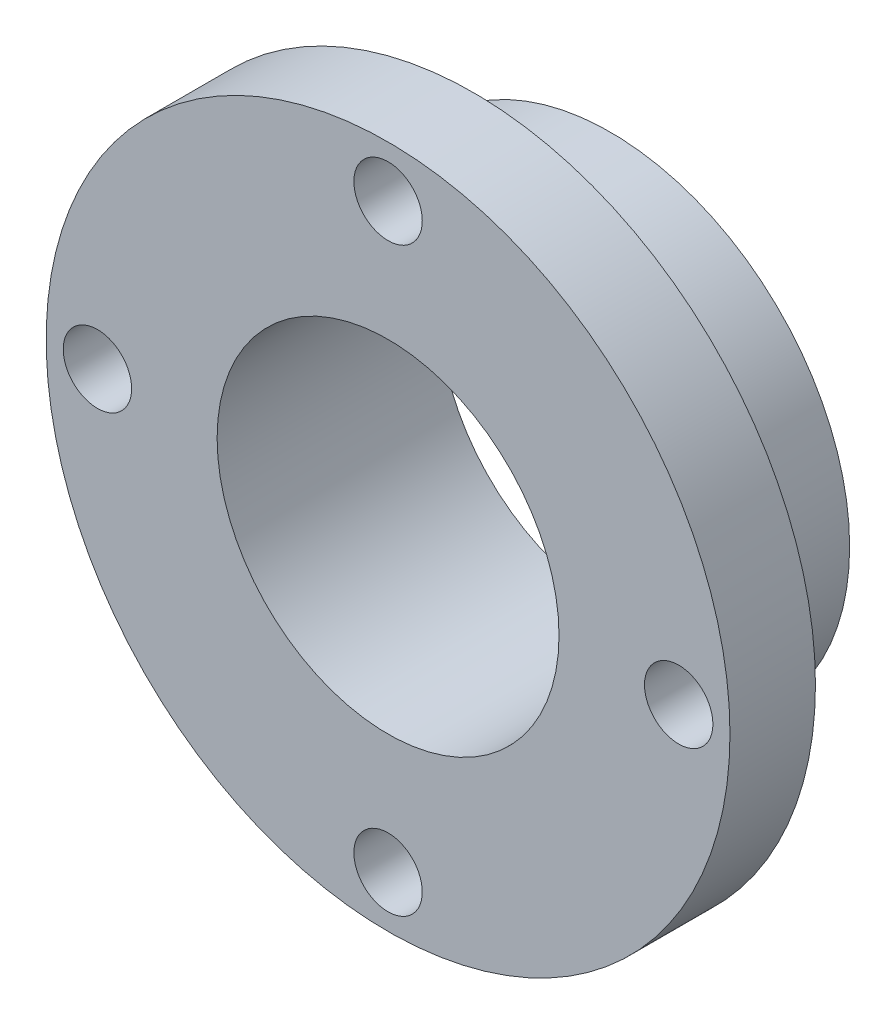
ISO-10303-21;
HEADER;
FILE_DESCRIPTION(('STEP AP214'),'2;1');
FILE_NAME('part.step','',(''),(''),'','','');
FILE_SCHEMA(('AUTOMOTIVE_DESIGN { 1 0 10303 214 1 1 1 1 }'));
ENDSEC;
DATA;
#1=APPLICATION_CONTEXT('core data for automotive mechanical design processes');
#2=APPLICATION_PROTOCOL_DEFINITION('international standard','automotive_design',2000,#1);
#3=PRODUCT_CONTEXT('',#1,'mechanical');
#4=PRODUCT('Part','Part','',(#3));
#5=PRODUCT_RELATED_PRODUCT_CATEGORY('part','',(#4));
#6=PRODUCT_DEFINITION_FORMATION('','',#4);
#7=PRODUCT_DEFINITION_CONTEXT('part definition',#1,'design');
#8=PRODUCT_DEFINITION('design','',#6,#7);
#9=PRODUCT_DEFINITION_SHAPE('','',#8);
#10=(LENGTH_UNIT() NAMED_UNIT(*) SI_UNIT(.MILLI.,.METRE.));
#11=(NAMED_UNIT(*) PLANE_ANGLE_UNIT() SI_UNIT($,.RADIAN.));
#12=(NAMED_UNIT(*) SI_UNIT($,.STERADIAN.) SOLID_ANGLE_UNIT());
#13=UNCERTAINTY_MEASURE_WITH_UNIT(LENGTH_MEASURE(1.E-05),#10,'distance_accuracy_value','');
#14=(GEOMETRIC_REPRESENTATION_CONTEXT(3) GLOBAL_UNCERTAINTY_ASSIGNED_CONTEXT((#13)) GLOBAL_UNIT_ASSIGNED_CONTEXT((#10,
#11,#12)) REPRESENTATION_CONTEXT('',''));
#15=CARTESIAN_POINT('',(0.,0.,0.));
#16=DIRECTION('',(0.,0.,1.));
#17=DIRECTION('',(1.,0.,0.));
#18=AXIS2_PLACEMENT_3D('',#15,#16,#17);
#19=CARTESIAN_POINT('',(0.,0.,0.));
#20=DIRECTION('',(0.,0.,1.));
#21=DIRECTION('',(1.,0.,0.));
#22=AXIS2_PLACEMENT_3D('',#19,#20,#21);
#23=PLANE('',#22);
#24=CARTESIAN_POINT('',(0.,0.,0.));
#25=DIRECTION('',(0.,0.,1.));
#26=DIRECTION('',(1.,0.,0.));
#27=AXIS2_PLACEMENT_3D('',#24,#25,#26);
#28=CIRCLE('',#27,15.);
#29=CARTESIAN_POINT('',(0.,-15.,0.));
#30=VERTEX_POINT('',#29);
#31=CARTESIAN_POINT('',(15.,0.,0.));
#32=VERTEX_POINT('',#31);
#33=EDGE_CURVE('E70',#30,#32,#28,.T.);
#34=ORIENTED_EDGE('',*,*,#33,.T.);
#35=CARTESIAN_POINT('',(17.,0.,0.));
#36=DIRECTION('',(0.,0.,-1.));
#37=DIRECTION('',(0.,1.,0.));
#38=AXIS2_PLACEMENT_3D('',#35,#36,#37);
#39=CIRCLE('',#38,2.);
#40=EDGE_CURVE('E49',#32,#32,#39,.T.);
#41=ORIENTED_EDGE('',*,*,#40,.F.);
#42=CARTESIAN_POINT('',(0.,15.,0.));
#43=VERTEX_POINT('',#42);
#44=EDGE_CURVE('E44',#32,#43,#28,.T.);
#45=ORIENTED_EDGE('',*,*,#44,.T.);
#46=CARTESIAN_POINT('',(0.,17.,0.));
#47=DIRECTION('',(0.,0.,-1.));
#48=DIRECTION('',(-1.,0.,0.));
#49=AXIS2_PLACEMENT_3D('',#46,#47,#48);
#50=CIRCLE('',#49,2.);
#51=EDGE_CURVE('E66',#43,#43,#50,.T.);
#52=ORIENTED_EDGE('',*,*,#51,.F.);
#53=CARTESIAN_POINT('',(-15.,1.57116660247941E-13,0.));
#54=VERTEX_POINT('',#53);
#55=EDGE_CURVE('E11',#43,#54,#28,.T.);
#56=ORIENTED_EDGE('',*,*,#55,.T.);
#57=CARTESIAN_POINT('',(-17.,1.78065548281E-13,0.));
#58=DIRECTION('',(0.,0.,-1.));
#59=DIRECTION('',(0.,-1.,0.));
#60=AXIS2_PLACEMENT_3D('',#57,#58,#59);
#61=CIRCLE('',#60,2.);
#62=EDGE_CURVE('E171',#54,#54,#61,.T.);
#63=ORIENTED_EDGE('',*,*,#62,.F.);
#64=EDGE_CURVE('E43',#54,#30,#28,.T.);
#65=ORIENTED_EDGE('',*,*,#64,.T.);
#66=CARTESIAN_POINT('',(0.,-17.,0.));
#67=DIRECTION('',(0.,0.,-1.));
#68=DIRECTION('',(1.,0.,0.));
#69=AXIS2_PLACEMENT_3D('',#66,#67,#68);
#70=CIRCLE('',#69,2.);
#71=EDGE_CURVE('E54',#30,#30,#70,.T.);
#72=ORIENTED_EDGE('',*,*,#71,.F.);
#73=EDGE_LOOP('',(#34,#41,#45,#52,#56,#63,#65,#72));
#74=FACE_BOUND('',#73,.T.);
#75=CARTESIAN_POINT('',(0.,0.,0.));
#76=DIRECTION('',(0.,0.,1.));
#77=DIRECTION('',(1.,0.,0.));
#78=AXIS2_PLACEMENT_3D('',#75,#76,#77);
#79=CIRCLE('',#78,20.);
#80=CARTESIAN_POINT('',(20.,0.,0.));
#81=VERTEX_POINT('',#80);
#82=EDGE_CURVE('E93',#81,#81,#79,.T.);
#83=ORIENTED_EDGE('',*,*,#82,.F.);
#84=EDGE_LOOP('',(#83));
#85=FACE_BOUND('',#84,.T.);
#86=ADVANCED_FACE('F35',(#74,#85),#23,.F.);
#87=CARTESIAN_POINT('',(0.,0.,5.));
#88=DIRECTION('',(0.,0.,1.));
#89=DIRECTION('',(1.,0.,0.));
#90=AXIS2_PLACEMENT_3D('',#87,#88,#89);
#91=PLANE('',#90);
#92=CARTESIAN_POINT('',(17.,0.,5.));
#93=DIRECTION('',(0.,0.,1.));
#94=DIRECTION('',(1.,0.,0.));
#95=AXIS2_PLACEMENT_3D('',#92,#93,#94);
#96=CIRCLE('',#95,2.);
#97=CARTESIAN_POINT('',(19.,0.,5.));
#98=VERTEX_POINT('',#97);
#99=EDGE_CURVE('E75',#98,#98,#96,.T.);
#100=ORIENTED_EDGE('',*,*,#99,.F.);
#101=EDGE_LOOP('',(#100));
#102=FACE_BOUND('',#101,.T.);
#103=CARTESIAN_POINT('',(0.,-17.,5.));
#104=DIRECTION('',(0.,0.,1.));
#105=DIRECTION('',(1.,0.,0.));
#106=AXIS2_PLACEMENT_3D('',#103,#104,#105);
#107=CIRCLE('',#106,2.);
#108=CARTESIAN_POINT('',(2.,-17.,5.));
#109=VERTEX_POINT('',#108);
#110=EDGE_CURVE('E81',#109,#109,#107,.T.);
#111=ORIENTED_EDGE('',*,*,#110,.F.);
#112=EDGE_LOOP('',(#111));
#113=FACE_BOUND('',#112,.T.);
#114=CARTESIAN_POINT('',(-17.,1.78065548281E-13,5.));
#115=DIRECTION('',(0.,0.,1.));
#116=DIRECTION('',(1.,0.,0.));
#117=AXIS2_PLACEMENT_3D('',#114,#115,#116);
#118=CIRCLE('',#117,2.);
#119=CARTESIAN_POINT('',(-15.,1.78065548281E-13,5.));
#120=VERTEX_POINT('',#119);
#121=EDGE_CURVE('E166',#120,#120,#118,.T.);
#122=ORIENTED_EDGE('',*,*,#121,.F.);
#123=EDGE_LOOP('',(#122));
#124=FACE_BOUND('',#123,.T.);
#125=CARTESIAN_POINT('',(0.,17.,5.));
#126=DIRECTION('',(0.,0.,1.));
#127=DIRECTION('',(1.,0.,0.));
#128=AXIS2_PLACEMENT_3D('',#125,#126,#127);
#129=CIRCLE('',#128,2.);
#130=CARTESIAN_POINT('',(2.,17.,5.));
#131=VERTEX_POINT('',#130);
#132=EDGE_CURVE('E74',#131,#131,#129,.T.);
#133=ORIENTED_EDGE('',*,*,#132,.F.);
#134=EDGE_LOOP('',(#133));
#135=FACE_BOUND('',#134,.T.);
#136=CARTESIAN_POINT('',(0.,0.,5.));
#137=DIRECTION('',(0.,0.,1.));
#138=DIRECTION('',(1.,0.,0.));
#139=AXIS2_PLACEMENT_3D('',#136,#137,#138);
#140=CIRCLE('',#139,20.);
#141=CARTESIAN_POINT('',(20.,0.,5.));
#142=VERTEX_POINT('',#141);
#143=EDGE_CURVE('E94',#142,#142,#140,.T.);
#144=ORIENTED_EDGE('',*,*,#143,.T.);
#145=EDGE_LOOP('',(#144));
#146=FACE_BOUND('',#145,.T.);
#147=CARTESIAN_POINT('',(0.,0.,5.));
#148=DIRECTION('',(0.,0.,1.));
#149=DIRECTION('',(1.,0.,0.));
#150=AXIS2_PLACEMENT_3D('',#147,#148,#149);
#151=CIRCLE('',#150,10.);
#152=CARTESIAN_POINT('',(10.,0.,5.));
#153=VERTEX_POINT('',#152);
#154=EDGE_CURVE('E90',#153,#153,#151,.T.);
#155=ORIENTED_EDGE('',*,*,#154,.F.);
#156=EDGE_LOOP('',(#155));
#157=FACE_BOUND('',#156,.T.);
#158=ADVANCED_FACE('F115',(#102,#113,#124,#135,#146,#157),#91,.T.);
#159=CARTESIAN_POINT('',(0.,0.,5.));
#160=DIRECTION('',(0.,0.,-1.));
#161=DIRECTION('',(-1.,0.,0.));
#162=AXIS2_PLACEMENT_3D('',#159,#160,#161);
#163=CYLINDRICAL_SURFACE('',#162,20.);
#164=ORIENTED_EDGE('',*,*,#143,.F.);
#165=EDGE_LOOP('',(#164));
#166=FACE_BOUND('',#165,.T.);
#167=ORIENTED_EDGE('',*,*,#82,.T.);
#168=EDGE_LOOP('',(#167));
#169=FACE_BOUND('',#168,.T.);
#170=ADVANCED_FACE('F120',(#166,#169),#163,.T.);
#171=CARTESIAN_POINT('',(0.,0.,5.));
#172=DIRECTION('',(0.,0.,-1.));
#173=DIRECTION('',(-1.,0.,0.));
#174=AXIS2_PLACEMENT_3D('',#171,#172,#173);
#175=CYLINDRICAL_SURFACE('',#174,10.);
#176=ORIENTED_EDGE('',*,*,#154,.T.);
#177=EDGE_LOOP('',(#176));
#178=FACE_BOUND('',#177,.T.);
#179=CARTESIAN_POINT('',(0.,0.,-8.));
#180=DIRECTION('',(0.,0.,-1.));
#181=DIRECTION('',(-1.,0.,0.));
#182=AXIS2_PLACEMENT_3D('',#179,#180,#181);
#183=CIRCLE('',#182,10.);
#184=CARTESIAN_POINT('',(-10.,0.,-8.));
#185=VERTEX_POINT('',#184);
#186=EDGE_CURVE('E78',#185,#185,#183,.T.);
#187=ORIENTED_EDGE('',*,*,#186,.T.);
#188=EDGE_LOOP('',(#187));
#189=FACE_BOUND('',#188,.T.);
#190=ADVANCED_FACE('F125',(#178,#189),#175,.F.);
#191=CARTESIAN_POINT('',(0.,0.,-8.));
#192=DIRECTION('',(0.,0.,-1.));
#193=DIRECTION('',(-1.,0.,0.));
#194=AXIS2_PLACEMENT_3D('',#191,#192,#193);
#195=PLANE('',#194);
#196=CARTESIAN_POINT('',(0.,0.,-8.));
#197=DIRECTION('',(0.,0.,-1.));
#198=DIRECTION('',(-1.,0.,0.));
#199=AXIS2_PLACEMENT_3D('',#196,#197,#198);
#200=CIRCLE('',#199,14.);
#201=CARTESIAN_POINT('',(-14.,0.,-8.));
#202=VERTEX_POINT('',#201);
#203=EDGE_CURVE('E87',#202,#202,#200,.T.);
#204=ORIENTED_EDGE('',*,*,#203,.T.);
#205=EDGE_LOOP('',(#204));
#206=FACE_BOUND('',#205,.T.);
#207=ORIENTED_EDGE('',*,*,#186,.F.);
#208=EDGE_LOOP('',(#207));
#209=FACE_BOUND('',#208,.T.);
#210=ADVANCED_FACE('F112',(#206,#209),#195,.T.);
#211=CARTESIAN_POINT('',(0.,0.,-8.));
#212=DIRECTION('',(0.,0.,1.));
#213=DIRECTION('',(1.,0.,0.));
#214=AXIS2_PLACEMENT_3D('',#211,#212,#213);
#215=CYLINDRICAL_SURFACE('',#214,14.);
#216=CARTESIAN_POINT('',(0.,0.,-1.));
#217=DIRECTION('',(0.,0.,1.));
#218=DIRECTION('',(1.,0.,0.));
#219=AXIS2_PLACEMENT_3D('',#216,#217,#218);
#220=CIRCLE('',#219,14.);
#221=CARTESIAN_POINT('',(14.,0.,-1.));
#222=VERTEX_POINT('',#221);
#223=EDGE_CURVE('E71',#222,#222,#220,.F.);
#224=ORIENTED_EDGE('',*,*,#223,.T.);
#225=EDGE_LOOP('',(#224));
#226=FACE_BOUND('',#225,.T.);
#227=ORIENTED_EDGE('',*,*,#203,.F.);
#228=EDGE_LOOP('',(#227));
#229=FACE_BOUND('',#228,.T.);
#230=ADVANCED_FACE('F101',(#226,#229),#215,.T.);
#231=CARTESIAN_POINT('',(0.,0.,-1.));
#232=DIRECTION('',(0.,0.,1.));
#233=DIRECTION('',(1.,0.,0.));
#234=AXIS2_PLACEMENT_3D('',#231,#232,#233);
#235=TOROIDAL_SURFACE('',#234,15.,1.);
#236=ORIENTED_EDGE('',*,*,#55,.F.);
#237=ORIENTED_EDGE('',*,*,#44,.F.);
#238=ORIENTED_EDGE('',*,*,#33,.F.);
#239=ORIENTED_EDGE('',*,*,#64,.F.);
#240=EDGE_LOOP('',(#236,#237,#238,#239));
#241=FACE_BOUND('',#240,.T.);
#242=ORIENTED_EDGE('',*,*,#223,.F.);
#243=EDGE_LOOP('',(#242));
#244=FACE_BOUND('',#243,.T.);
#245=ADVANCED_FACE('F37',(#241,#244),#235,.F.);
#246=CARTESIAN_POINT('',(0.,17.,10.));
#247=DIRECTION('',(0.,0.,-1.));
#248=DIRECTION('',(-1.,0.,0.));
#249=AXIS2_PLACEMENT_3D('',#246,#247,#248);
#250=CYLINDRICAL_SURFACE('',#249,2.);
#251=ORIENTED_EDGE('',*,*,#132,.T.);
#252=EDGE_LOOP('',(#251));
#253=FACE_BOUND('',#252,.T.);
#254=ORIENTED_EDGE('',*,*,#51,.T.);
#255=EDGE_LOOP('',(#254));
#256=FACE_BOUND('',#255,.T.);
#257=ADVANCED_FACE('F73',(#253,#256),#250,.F.);
#258=CARTESIAN_POINT('',(-17.,1.78065548281E-13,10.));
#259=DIRECTION('',(0.,0.,-1.));
#260=DIRECTION('',(-1.,0.,0.));
#261=AXIS2_PLACEMENT_3D('',#258,#259,#260);
#262=CYLINDRICAL_SURFACE('',#261,2.);
#263=ORIENTED_EDGE('',*,*,#121,.T.);
#264=EDGE_LOOP('',(#263));
#265=FACE_BOUND('',#264,.T.);
#266=ORIENTED_EDGE('',*,*,#62,.T.);
#267=EDGE_LOOP('',(#266));
#268=FACE_BOUND('',#267,.T.);
#269=ADVANCED_FACE('F109',(#265,#268),#262,.F.);
#270=CARTESIAN_POINT('',(0.,-17.,10.));
#271=DIRECTION('',(0.,0.,-1.));
#272=DIRECTION('',(-1.,0.,0.));
#273=AXIS2_PLACEMENT_3D('',#270,#271,#272);
#274=CYLINDRICAL_SURFACE('',#273,2.);
#275=ORIENTED_EDGE('',*,*,#110,.T.);
#276=EDGE_LOOP('',(#275));
#277=FACE_BOUND('',#276,.T.);
#278=ORIENTED_EDGE('',*,*,#71,.T.);
#279=EDGE_LOOP('',(#278));
#280=FACE_BOUND('',#279,.T.);
#281=ADVANCED_FACE('F148',(#277,#280),#274,.F.);
#282=CARTESIAN_POINT('',(17.,0.,10.));
#283=DIRECTION('',(0.,0.,-1.));
#284=DIRECTION('',(-1.,0.,0.));
#285=AXIS2_PLACEMENT_3D('',#282,#283,#284);
#286=CYLINDRICAL_SURFACE('',#285,2.);
#287=ORIENTED_EDGE('',*,*,#99,.T.);
#288=EDGE_LOOP('',(#287));
#289=FACE_BOUND('',#288,.T.);
#290=ORIENTED_EDGE('',*,*,#40,.T.);
#291=EDGE_LOOP('',(#290));
#292=FACE_BOUND('',#291,.T.);
#293=ADVANCED_FACE('F152',(#289,#292),#286,.F.);
#294=CLOSED_SHELL('',(#86,#158,#170,#190,#210,#230,#245,#257,#269,#281,#293));
#295=MANIFOLD_SOLID_BREP('B2',#294);
#296=ADVANCED_BREP_SHAPE_REPRESENTATION('',(#18,#295),#14);
#297=SHAPE_DEFINITION_REPRESENTATION(#9,#296);
ENDSEC;
END-ISO-10303-21;
